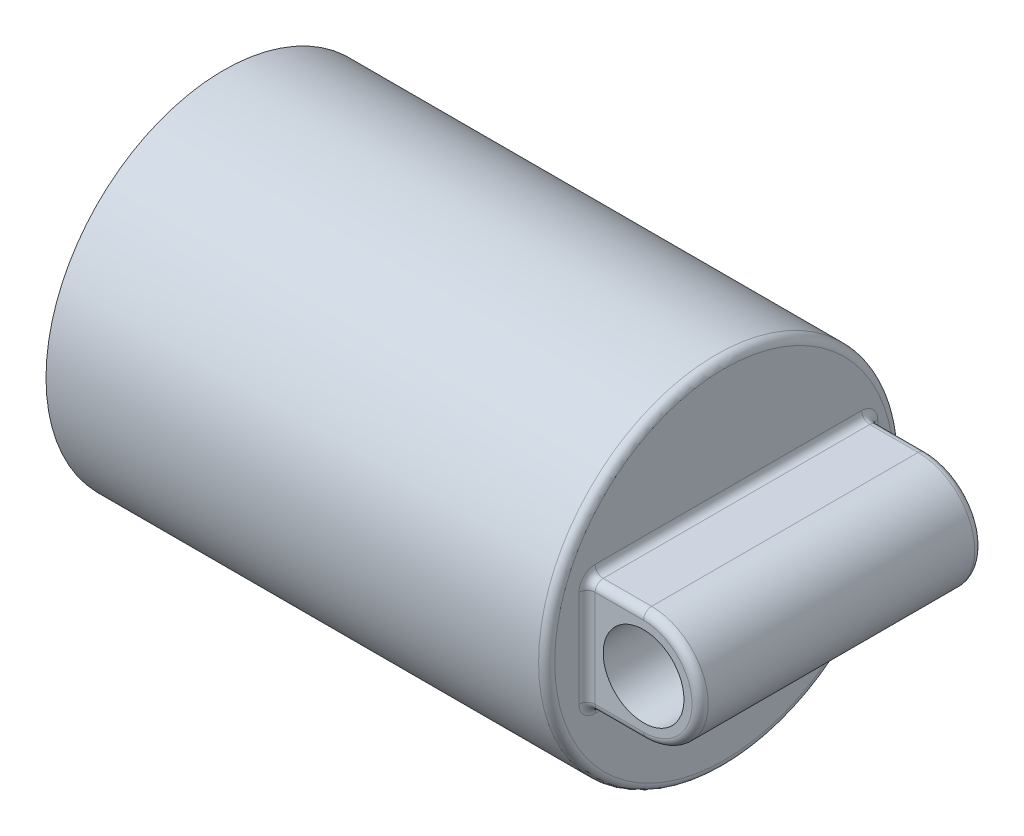
ISO-10303-21;
HEADER;
FILE_DESCRIPTION(('STEP AP214'),'2;1');
FILE_NAME('part.step','',(''),(''),'','','');
FILE_SCHEMA(('AUTOMOTIVE_DESIGN { 1 0 10303 214 1 1 1 1 }'));
ENDSEC;
DATA;
#1=APPLICATION_CONTEXT('core data for automotive mechanical design processes');
#2=APPLICATION_PROTOCOL_DEFINITION('international standard','automotive_design',2000,#1);
#3=PRODUCT_CONTEXT('',#1,'mechanical');
#4=PRODUCT('Part','Part','',(#3));
#5=PRODUCT_RELATED_PRODUCT_CATEGORY('part','',(#4));
#6=PRODUCT_DEFINITION_FORMATION('','',#4);
#7=PRODUCT_DEFINITION_CONTEXT('part definition',#1,'design');
#8=PRODUCT_DEFINITION('design','',#6,#7);
#9=PRODUCT_DEFINITION_SHAPE('','',#8);
#10=(LENGTH_UNIT() NAMED_UNIT(*) SI_UNIT(.MILLI.,.METRE.));
#11=(NAMED_UNIT(*) PLANE_ANGLE_UNIT() SI_UNIT($,.RADIAN.));
#12=(NAMED_UNIT(*) SI_UNIT($,.STERADIAN.) SOLID_ANGLE_UNIT());
#13=UNCERTAINTY_MEASURE_WITH_UNIT(LENGTH_MEASURE(1.E-05),#10,'distance_accuracy_value','');
#14=(GEOMETRIC_REPRESENTATION_CONTEXT(3) GLOBAL_UNCERTAINTY_ASSIGNED_CONTEXT((#13)) GLOBAL_UNIT_ASSIGNED_CONTEXT((#10,
#11,#12)) REPRESENTATION_CONTEXT('',''));
#15=CARTESIAN_POINT('',(0.,0.,0.));
#16=DIRECTION('',(0.,0.,1.));
#17=DIRECTION('',(1.,0.,0.));
#18=AXIS2_PLACEMENT_3D('',#15,#16,#17);
#19=CARTESIAN_POINT('',(2.,22.,0.));
#20=DIRECTION('',(-1.,0.,0.));
#21=DIRECTION('',(0.,0.,1.));
#22=AXIS2_PLACEMENT_3D('',#19,#20,#21);
#23=PLANE('',#22);
#24=CARTESIAN_POINT('',(2.,0.,0.));
#25=DIRECTION('',(-1.,0.,0.));
#26=DIRECTION('',(0.,0.,1.));
#27=AXIS2_PLACEMENT_3D('',#24,#25,#26);
#28=CIRCLE('',#27,21.);
#29=CARTESIAN_POINT('',(2.,0.,21.));
#30=VERTEX_POINT('',#29);
#31=EDGE_CURVE('E151',#30,#30,#28,.F.);
#32=ORIENTED_EDGE('',*,*,#31,.T.);
#33=EDGE_LOOP('',(#32));
#34=FACE_BOUND('',#33,.T.);
#35=CARTESIAN_POINT('',(2.,-6.,16.));
#36=DIRECTION('',(-1.,0.,0.));
#37=DIRECTION('',(0.,0.,1.));
#38=AXIS2_PLACEMENT_3D('',#35,#36,#37);
#39=CIRCLE('',#38,2.);
#40=CARTESIAN_POINT('',(2.,-6.,18.));
#41=VERTEX_POINT('',#40);
#42=CARTESIAN_POINT('',(2.,-8.,16.));
#43=VERTEX_POINT('',#42);
#44=EDGE_CURVE('E231',#41,#43,#39,.F.);
#45=ORIENTED_EDGE('',*,*,#44,.F.);
#46=DIRECTION('',(0.,-1.,0.));
#47=VECTOR('',#46,1.);
#48=CARTESIAN_POINT('',(2.,22.,18.));
#49=LINE('',#48,#47);
#50=CARTESIAN_POINT('',(2.,6.,18.));
#51=VERTEX_POINT('',#50);
#52=EDGE_CURVE('E228',#41,#51,#49,.F.);
#53=ORIENTED_EDGE('',*,*,#52,.T.);
#54=CARTESIAN_POINT('',(2.,6.,16.));
#55=DIRECTION('',(-1.,0.,0.));
#56=DIRECTION('',(0.,0.,1.));
#57=AXIS2_PLACEMENT_3D('',#54,#55,#56);
#58=CIRCLE('',#57,2.);
#59=CARTESIAN_POINT('',(2.,8.,16.));
#60=VERTEX_POINT('',#59);
#61=EDGE_CURVE('E225',#60,#51,#58,.F.);
#62=ORIENTED_EDGE('',*,*,#61,.F.);
#63=DIRECTION('',(0.,0.,1.));
#64=VECTOR('',#63,1.);
#65=CARTESIAN_POINT('',(2.,8.,0.));
#66=LINE('',#65,#64);
#67=CARTESIAN_POINT('',(2.,8.,-17.));
#68=VERTEX_POINT('',#67);
#69=EDGE_CURVE('E221',#60,#68,#66,.F.);
#70=ORIENTED_EDGE('',*,*,#69,.T.);
#71=CARTESIAN_POINT('',(2.,6.,-17.));
#72=DIRECTION('',(-1.,0.,0.));
#73=DIRECTION('',(0.,0.,1.));
#74=AXIS2_PLACEMENT_3D('',#71,#72,#73);
#75=CIRCLE('',#74,2.);
#76=CARTESIAN_POINT('',(2.,6.,-19.));
#77=VERTEX_POINT('',#76);
#78=EDGE_CURVE('E218',#77,#68,#75,.F.);
#79=ORIENTED_EDGE('',*,*,#78,.F.);
#80=DIRECTION('',(0.,-1.,0.));
#81=VECTOR('',#80,1.);
#82=CARTESIAN_POINT('',(2.,-7.,-19.));
#83=LINE('',#82,#81);
#84=CARTESIAN_POINT('',(2.,-6.,-19.));
#85=VERTEX_POINT('',#84);
#86=EDGE_CURVE('E216',#77,#85,#83,.T.);
#87=ORIENTED_EDGE('',*,*,#86,.T.);
#88=CARTESIAN_POINT('',(2.,-6.,-17.));
#89=DIRECTION('',(-1.,0.,0.));
#90=DIRECTION('',(0.,0.,1.));
#91=AXIS2_PLACEMENT_3D('',#88,#89,#90);
#92=CIRCLE('',#91,2.);
#93=CARTESIAN_POINT('',(2.,-8.,-17.));
#94=VERTEX_POINT('',#93);
#95=EDGE_CURVE('E214',#94,#85,#92,.F.);
#96=ORIENTED_EDGE('',*,*,#95,.F.);
#97=DIRECTION('',(0.,0.,1.));
#98=VECTOR('',#97,1.);
#99=CARTESIAN_POINT('',(2.,-8.,0.));
#100=LINE('',#99,#98);
#101=EDGE_CURVE('E223',#94,#43,#100,.T.);
#102=ORIENTED_EDGE('',*,*,#101,.T.);
#103=EDGE_LOOP('',(#45,#53,#62,#70,#79,#87,#96,#102));
#104=FACE_BOUND('',#103,.T.);
#105=ADVANCED_FACE('F36',(#34,#104),#23,.F.);
#106=CARTESIAN_POINT('',(0.,0.,0.));
#107=DIRECTION('',(1.,0.,0.));
#108=DIRECTION('',(0.,0.,-1.));
#109=AXIS2_PLACEMENT_3D('',#106,#107,#108);
#110=PLANE('',#109);
#111=CARTESIAN_POINT('',(0.,0.,0.));
#112=DIRECTION('',(-1.,0.,0.));
#113=DIRECTION('',(0.,0.,1.));
#114=AXIS2_PLACEMENT_3D('',#111,#112,#113);
#115=CIRCLE('',#114,20.);
#116=CARTESIAN_POINT('',(0.,0.,20.));
#117=VERTEX_POINT('',#116);
#118=EDGE_CURVE('E204',#117,#117,#115,.T.);
#119=ORIENTED_EDGE('',*,*,#118,.T.);
#120=EDGE_LOOP('',(#119));
#121=FACE_BOUND('',#120,.T.);
#122=ADVANCED_FACE('F306',(#121),#110,.F.);
#123=CARTESIAN_POINT('',(-25.911369331656,0.,0.));
#124=DIRECTION('',(-1.,0.,0.));
#125=DIRECTION('',(0.,0.,1.));
#126=AXIS2_PLACEMENT_3D('',#123,#124,#125);
#127=CYLINDRICAL_SURFACE('',#126,20.);
#128=ORIENTED_EDGE('',*,*,#118,.F.);
#129=EDGE_LOOP('',(#128));
#130=FACE_BOUND('',#129,.T.);
#131=CARTESIAN_POINT('',(-60.,0.,0.));
#132=DIRECTION('',(-1.,0.,0.));
#133=DIRECTION('',(0.,0.,1.));
#134=AXIS2_PLACEMENT_3D('',#131,#132,#133);
#135=CIRCLE('',#134,20.);
#136=CARTESIAN_POINT('',(-60.,0.,20.));
#137=VERTEX_POINT('',#136);
#138=EDGE_CURVE('E201',#137,#137,#135,.T.);
#139=ORIENTED_EDGE('',*,*,#138,.T.);
#140=EDGE_LOOP('',(#139));
#141=FACE_BOUND('',#140,.T.);
#142=ADVANCED_FACE('F312',(#130,#141),#127,.F.);
#143=CARTESIAN_POINT('',(-60.,20.,0.));
#144=DIRECTION('',(1.,0.,0.));
#145=DIRECTION('',(0.,0.,-1.));
#146=AXIS2_PLACEMENT_3D('',#143,#144,#145);
#147=PLANE('',#146);
#148=ORIENTED_EDGE('',*,*,#138,.F.);
#149=EDGE_LOOP('',(#148));
#150=FACE_BOUND('',#149,.T.);
#151=CARTESIAN_POINT('',(-60.,0.,0.));
#152=DIRECTION('',(-1.,0.,0.));
#153=DIRECTION('',(0.,0.,1.));
#154=AXIS2_PLACEMENT_3D('',#151,#152,#153);
#155=CIRCLE('',#154,22.);
#156=CARTESIAN_POINT('',(-60.,0.,22.));
#157=VERTEX_POINT('',#156);
#158=EDGE_CURVE('E196',#157,#157,#155,.T.);
#159=ORIENTED_EDGE('',*,*,#158,.T.);
#160=EDGE_LOOP('',(#159));
#161=FACE_BOUND('',#160,.T.);
#162=ADVANCED_FACE('F322',(#150,#161),#147,.F.);
#163=CARTESIAN_POINT('',(-25.911369331656,0.,0.));
#164=DIRECTION('',(-1.,0.,0.));
#165=DIRECTION('',(0.,0.,1.));
#166=AXIS2_PLACEMENT_3D('',#163,#164,#165);
#167=CYLINDRICAL_SURFACE('',#166,22.);
#168=CARTESIAN_POINT('',(1.,0.,0.));
#169=DIRECTION('',(-1.,0.,0.));
#170=DIRECTION('',(0.,0.,1.));
#171=AXIS2_PLACEMENT_3D('',#168,#169,#170);
#172=CIRCLE('',#171,22.);
#173=CARTESIAN_POINT('',(1.,0.,22.));
#174=VERTEX_POINT('',#173);
#175=EDGE_CURVE('E207',#174,#174,#172,.T.);
#176=ORIENTED_EDGE('',*,*,#175,.T.);
#177=EDGE_LOOP('',(#176));
#178=FACE_BOUND('',#177,.T.);
#179=ORIENTED_EDGE('',*,*,#158,.F.);
#180=EDGE_LOOP('',(#179));
#181=FACE_BOUND('',#180,.T.);
#182=ADVANCED_FACE('F319',(#178,#181),#167,.T.);
#183=CARTESIAN_POINT('',(9.,0.,-18.));
#184=DIRECTION('',(0.,0.,1.));
#185=DIRECTION('',(1.,0.,0.));
#186=AXIS2_PLACEMENT_3D('',#183,#184,#185);
#187=CYLINDRICAL_SURFACE('',#186,7.);
#188=DIRECTION('',(0.,0.,1.));
#189=VECTOR('',#188,1.);
#190=CARTESIAN_POINT('',(9.,-7.,-18.));
#191=LINE('',#190,#189);
#192=CARTESIAN_POINT('',(9.,-7.,-17.));
#193=VERTEX_POINT('',#192);
#194=CARTESIAN_POINT('',(9.,-7.,16.));
#195=VERTEX_POINT('',#194);
#196=EDGE_CURVE('E193',#193,#195,#191,.T.);
#197=ORIENTED_EDGE('',*,*,#196,.F.);
#198=CARTESIAN_POINT('',(9.,0.,-17.));
#199=DIRECTION('',(0.,0.,1.));
#200=DIRECTION('',(1.,0.,0.));
#201=AXIS2_PLACEMENT_3D('',#198,#199,#200);
#202=CIRCLE('',#201,7.);
#203=CARTESIAN_POINT('',(9.,7.,-17.));
#204=VERTEX_POINT('',#203);
#205=EDGE_CURVE('E11',#193,#204,#202,.T.);
#206=ORIENTED_EDGE('',*,*,#205,.T.);
#207=DIRECTION('',(0.,0.,1.));
#208=VECTOR('',#207,1.);
#209=CARTESIAN_POINT('',(9.,7.,-18.));
#210=LINE('',#209,#208);
#211=CARTESIAN_POINT('',(9.,7.,16.));
#212=VERTEX_POINT('',#211);
#213=EDGE_CURVE('E190',#204,#212,#210,.T.);
#214=ORIENTED_EDGE('',*,*,#213,.T.);
#215=CARTESIAN_POINT('',(9.,0.,16.));
#216=DIRECTION('',(0.,0.,1.));
#217=DIRECTION('',(1.,0.,0.));
#218=AXIS2_PLACEMENT_3D('',#215,#216,#217);
#219=CIRCLE('',#218,7.);
#220=EDGE_CURVE('E45',#212,#195,#219,.F.);
#221=ORIENTED_EDGE('',*,*,#220,.T.);
#222=EDGE_LOOP('',(#197,#206,#214,#221));
#223=FACE_BOUND('',#222,.T.);
#224=ADVANCED_FACE('F317',(#223),#187,.T.);
#225=CARTESIAN_POINT('',(2.,-7.,-18.));
#226=DIRECTION('',(0.,-1.,0.));
#227=DIRECTION('',(1.,0.,0.));
#228=AXIS2_PLACEMENT_3D('',#225,#226,#227);
#229=PLANE('',#228);
#230=DIRECTION('',(0.,0.,1.));
#231=VECTOR('',#230,1.);
#232=CARTESIAN_POINT('',(3.,-7.,-18.));
#233=LINE('',#232,#231);
#234=CARTESIAN_POINT('',(3.,-7.,16.));
#235=VERTEX_POINT('',#234);
#236=CARTESIAN_POINT('',(3.,-7.,-17.));
#237=VERTEX_POINT('',#236);
#238=EDGE_CURVE('E235',#235,#237,#233,.F.);
#239=ORIENTED_EDGE('',*,*,#238,.T.);
#240=DIRECTION('',(1.,0.,0.));
#241=VECTOR('',#240,1.);
#242=CARTESIAN_POINT('',(9.,-7.,-17.));
#243=LINE('',#242,#241);
#244=EDGE_CURVE('E238',#237,#193,#243,.T.);
#245=ORIENTED_EDGE('',*,*,#244,.T.);
#246=ORIENTED_EDGE('',*,*,#196,.T.);
#247=DIRECTION('',(1.,0.,0.));
#248=VECTOR('',#247,1.);
#249=CARTESIAN_POINT('',(2.,-7.,16.));
#250=LINE('',#249,#248);
#251=EDGE_CURVE('E154',#195,#235,#250,.F.);
#252=ORIENTED_EDGE('',*,*,#251,.T.);
#253=EDGE_LOOP('',(#239,#245,#246,#252));
#254=FACE_BOUND('',#253,.T.);
#255=ADVANCED_FACE('F357',(#254),#229,.T.);
#256=CARTESIAN_POINT('',(9.,7.,-18.));
#257=DIRECTION('',(0.,1.,0.));
#258=DIRECTION('',(-1.,0.,0.));
#259=AXIS2_PLACEMENT_3D('',#256,#257,#258);
#260=PLANE('',#259);
#261=ORIENTED_EDGE('',*,*,#213,.F.);
#262=DIRECTION('',(-1.,0.,0.));
#263=VECTOR('',#262,1.);
#264=CARTESIAN_POINT('',(2.,7.,-17.));
#265=LINE('',#264,#263);
#266=CARTESIAN_POINT('',(3.,7.,-17.));
#267=VERTEX_POINT('',#266);
#268=EDGE_CURVE('E244',#204,#267,#265,.T.);
#269=ORIENTED_EDGE('',*,*,#268,.T.);
#270=DIRECTION('',(0.,0.,1.));
#271=VECTOR('',#270,1.);
#272=CARTESIAN_POINT('',(3.,7.,-18.));
#273=LINE('',#272,#271);
#274=CARTESIAN_POINT('',(3.,7.,16.));
#275=VERTEX_POINT('',#274);
#276=EDGE_CURVE('E242',#267,#275,#273,.T.);
#277=ORIENTED_EDGE('',*,*,#276,.T.);
#278=DIRECTION('',(-1.,0.,0.));
#279=VECTOR('',#278,1.);
#280=CARTESIAN_POINT('',(9.,7.,16.));
#281=LINE('',#280,#279);
#282=EDGE_CURVE('E240',#275,#212,#281,.F.);
#283=ORIENTED_EDGE('',*,*,#282,.T.);
#284=EDGE_LOOP('',(#261,#269,#277,#283));
#285=FACE_BOUND('',#284,.T.);
#286=ADVANCED_FACE('F355',(#285),#260,.T.);
#287=CARTESIAN_POINT('',(9.,0.,-18.));
#288=DIRECTION('',(0.,0.,1.));
#289=DIRECTION('',(1.,0.,0.));
#290=AXIS2_PLACEMENT_3D('',#287,#288,#289);
#291=PLANE('',#290);
#292=DIRECTION('',(1.,0.,0.));
#293=VECTOR('',#292,1.);
#294=CARTESIAN_POINT('',(2.,-6.,-18.));
#295=LINE('',#294,#293);
#296=CARTESIAN_POINT('',(9.,-6.,-18.));
#297=VERTEX_POINT('',#296);
#298=CARTESIAN_POINT('',(3.,-6.,-18.));
#299=VERTEX_POINT('',#298);
#300=EDGE_CURVE('E250',#297,#299,#295,.F.);
#301=ORIENTED_EDGE('',*,*,#300,.T.);
#302=DIRECTION('',(0.,-1.,0.));
#303=VECTOR('',#302,1.);
#304=CARTESIAN_POINT('',(3.,7.,-18.));
#305=LINE('',#304,#303);
#306=CARTESIAN_POINT('',(3.,6.,-18.));
#307=VERTEX_POINT('',#306);
#308=EDGE_CURVE('E61',#299,#307,#305,.F.);
#309=ORIENTED_EDGE('',*,*,#308,.T.);
#310=DIRECTION('',(-1.,0.,0.));
#311=VECTOR('',#310,1.);
#312=CARTESIAN_POINT('',(9.,6.,-18.));
#313=LINE('',#312,#311);
#314=CARTESIAN_POINT('',(9.,6.,-18.));
#315=VERTEX_POINT('',#314);
#316=EDGE_CURVE('E248',#307,#315,#313,.F.);
#317=ORIENTED_EDGE('',*,*,#316,.T.);
#318=CARTESIAN_POINT('',(9.,0.,-18.));
#319=DIRECTION('',(0.,0.,1.));
#320=DIRECTION('',(1.,0.,0.));
#321=AXIS2_PLACEMENT_3D('',#318,#319,#320);
#322=CIRCLE('',#321,6.);
#323=EDGE_CURVE('E246',#315,#297,#322,.F.);
#324=ORIENTED_EDGE('',*,*,#323,.T.);
#325=EDGE_LOOP('',(#301,#309,#317,#324));
#326=FACE_BOUND('',#325,.T.);
#327=CARTESIAN_POINT('',(9.,0.,-18.));
#328=DIRECTION('',(0.,0.,1.));
#329=DIRECTION('',(1.,0.,0.));
#330=AXIS2_PLACEMENT_3D('',#327,#328,#329);
#331=CIRCLE('',#330,5.);
#332=CARTESIAN_POINT('',(14.,0.,-18.));
#333=VERTEX_POINT('',#332);
#334=EDGE_CURVE('E185',#333,#333,#331,.T.);
#335=ORIENTED_EDGE('',*,*,#334,.T.);
#336=EDGE_LOOP('',(#335));
#337=FACE_BOUND('',#336,.T.);
#338=ADVANCED_FACE('F350',(#326,#337),#291,.F.);
#339=CARTESIAN_POINT('',(9.,0.,17.));
#340=DIRECTION('',(0.,0.,1.));
#341=DIRECTION('',(1.,0.,0.));
#342=AXIS2_PLACEMENT_3D('',#339,#340,#341);
#343=PLANE('',#342);
#344=DIRECTION('',(-1.,0.,0.));
#345=VECTOR('',#344,1.);
#346=CARTESIAN_POINT('',(9.,6.,17.));
#347=LINE('',#346,#345);
#348=CARTESIAN_POINT('',(9.,6.,17.));
#349=VERTEX_POINT('',#348);
#350=CARTESIAN_POINT('',(3.,6.,17.));
#351=VERTEX_POINT('',#350);
#352=EDGE_CURVE('E140',#349,#351,#347,.T.);
#353=ORIENTED_EDGE('',*,*,#352,.T.);
#354=DIRECTION('',(0.,-1.,0.));
#355=VECTOR('',#354,1.);
#356=CARTESIAN_POINT('',(3.,0.,17.));
#357=LINE('',#356,#355);
#358=CARTESIAN_POINT('',(3.,-6.,17.));
#359=VERTEX_POINT('',#358);
#360=EDGE_CURVE('E136',#351,#359,#357,.T.);
#361=ORIENTED_EDGE('',*,*,#360,.T.);
#362=DIRECTION('',(1.,0.,0.));
#363=VECTOR('',#362,1.);
#364=CARTESIAN_POINT('',(9.,-6.,17.));
#365=LINE('',#364,#363);
#366=CARTESIAN_POINT('',(9.,-6.,17.));
#367=VERTEX_POINT('',#366);
#368=EDGE_CURVE('E129',#359,#367,#365,.T.);
#369=ORIENTED_EDGE('',*,*,#368,.T.);
#370=CARTESIAN_POINT('',(9.,0.,17.));
#371=DIRECTION('',(0.,0.,1.));
#372=DIRECTION('',(1.,0.,0.));
#373=AXIS2_PLACEMENT_3D('',#370,#371,#372);
#374=CIRCLE('',#373,6.);
#375=EDGE_CURVE('E133',#367,#349,#374,.T.);
#376=ORIENTED_EDGE('',*,*,#375,.T.);
#377=EDGE_LOOP('',(#353,#361,#369,#376));
#378=FACE_BOUND('',#377,.T.);
#379=CARTESIAN_POINT('',(9.,0.,17.));
#380=DIRECTION('',(0.,0.,1.));
#381=DIRECTION('',(1.,0.,0.));
#382=AXIS2_PLACEMENT_3D('',#379,#380,#381);
#383=CIRCLE('',#382,5.);
#384=CARTESIAN_POINT('',(14.,0.,17.));
#385=VERTEX_POINT('',#384);
#386=EDGE_CURVE('E180',#385,#385,#383,.T.);
#387=ORIENTED_EDGE('',*,*,#386,.F.);
#388=EDGE_LOOP('',(#387));
#389=FACE_BOUND('',#388,.T.);
#390=ADVANCED_FACE('F131',(#378,#389),#343,.T.);
#391=CARTESIAN_POINT('',(9.,0.,-18.));
#392=DIRECTION('',(0.,0.,1.));
#393=DIRECTION('',(1.,0.,0.));
#394=AXIS2_PLACEMENT_3D('',#391,#392,#393);
#395=CYLINDRICAL_SURFACE('',#394,5.);
#396=ORIENTED_EDGE('',*,*,#334,.F.);
#397=EDGE_LOOP('',(#396));
#398=FACE_BOUND('',#397,.T.);
#399=ORIENTED_EDGE('',*,*,#386,.T.);
#400=EDGE_LOOP('',(#399));
#401=FACE_BOUND('',#400,.T.);
#402=ADVANCED_FACE('F331',(#398,#401),#395,.F.);
#403=CARTESIAN_POINT('',(1.,0.,0.));
#404=DIRECTION('',(-1.,0.,0.));
#405=DIRECTION('',(0.,0.,1.));
#406=AXIS2_PLACEMENT_3D('',#403,#404,#405);
#407=TOROIDAL_SURFACE('',#406,21.,1.);
#408=ORIENTED_EDGE('',*,*,#31,.F.);
#409=EDGE_LOOP('',(#408));
#410=FACE_BOUND('',#409,.T.);
#411=ORIENTED_EDGE('',*,*,#175,.F.);
#412=EDGE_LOOP('',(#411));
#413=FACE_BOUND('',#412,.T.);
#414=ADVANCED_FACE('F329',(#410,#413),#407,.T.);
#415=CARTESIAN_POINT('',(9.,0.,-17.));
#416=DIRECTION('',(0.,0.,1.));
#417=DIRECTION('',(1.,0.,0.));
#418=AXIS2_PLACEMENT_3D('',#415,#416,#417);
#419=TOROIDAL_SURFACE('',#418,6.,1.);
#420=CARTESIAN_POINT('',(9.,-6.,-17.));
#421=DIRECTION('',(-1.,0.,0.));
#422=DIRECTION('',(0.,0.,1.));
#423=AXIS2_PLACEMENT_3D('',#420,#421,#422);
#424=CIRCLE('',#423,1.);
#425=EDGE_CURVE('E173',#297,#193,#424,.T.);
#426=ORIENTED_EDGE('',*,*,#425,.F.);
#427=ORIENTED_EDGE('',*,*,#323,.F.);
#428=CARTESIAN_POINT('',(9.,6.,-17.));
#429=DIRECTION('',(-1.,0.,0.));
#430=DIRECTION('',(0.,0.,1.));
#431=AXIS2_PLACEMENT_3D('',#428,#429,#430);
#432=CIRCLE('',#431,1.);
#433=EDGE_CURVE('E40',#204,#315,#432,.T.);
#434=ORIENTED_EDGE('',*,*,#433,.F.);
#435=ORIENTED_EDGE('',*,*,#205,.F.);
#436=EDGE_LOOP('',(#426,#427,#434,#435));
#437=FACE_BOUND('',#436,.T.);
#438=ADVANCED_FACE('F38',(#437),#419,.T.);
#439=CARTESIAN_POINT('',(9.,6.,-17.));
#440=DIRECTION('',(1.,0.,0.));
#441=DIRECTION('',(0.,1.,0.));
#442=AXIS2_PLACEMENT_3D('',#439,#440,#441);
#443=CYLINDRICAL_SURFACE('',#442,1.);
#444=ORIENTED_EDGE('',*,*,#433,.T.);
#445=ORIENTED_EDGE('',*,*,#316,.F.);
#446=CARTESIAN_POINT('',(3.,6.,-17.));
#447=DIRECTION('',(-1.,0.,0.));
#448=DIRECTION('',(0.,0.,1.));
#449=AXIS2_PLACEMENT_3D('',#446,#447,#448);
#450=CIRCLE('',#449,1.);
#451=EDGE_CURVE('E168',#267,#307,#450,.T.);
#452=ORIENTED_EDGE('',*,*,#451,.F.);
#453=ORIENTED_EDGE('',*,*,#268,.F.);
#454=EDGE_LOOP('',(#444,#445,#452,#453));
#455=FACE_BOUND('',#454,.T.);
#456=ADVANCED_FACE('F337',(#455),#443,.T.);
#457=CARTESIAN_POINT('',(2.,-6.,-17.));
#458=DIRECTION('',(-1.,0.,0.));
#459=DIRECTION('',(0.,-1.,0.));
#460=AXIS2_PLACEMENT_3D('',#457,#458,#459);
#461=CYLINDRICAL_SURFACE('',#460,1.);
#462=ORIENTED_EDGE('',*,*,#425,.T.);
#463=ORIENTED_EDGE('',*,*,#244,.F.);
#464=CARTESIAN_POINT('',(3.,-6.,-17.));
#465=DIRECTION('',(-1.,0.,0.));
#466=DIRECTION('',(0.,0.,1.));
#467=AXIS2_PLACEMENT_3D('',#464,#465,#466);
#468=CIRCLE('',#467,1.);
#469=EDGE_CURVE('E166',#299,#237,#468,.T.);
#470=ORIENTED_EDGE('',*,*,#469,.F.);
#471=ORIENTED_EDGE('',*,*,#300,.F.);
#472=EDGE_LOOP('',(#462,#463,#470,#471));
#473=FACE_BOUND('',#472,.T.);
#474=ADVANCED_FACE('F370',(#473),#461,.T.);
#475=CARTESIAN_POINT('',(3.,22.,-19.));
#476=DIRECTION('',(0.,1.,0.));
#477=DIRECTION('',(0.,0.,1.));
#478=AXIS2_PLACEMENT_3D('',#475,#476,#477);
#479=CYLINDRICAL_SURFACE('',#478,1.);
#480=CARTESIAN_POINT('',(3.,-6.,-19.));
#481=DIRECTION('',(0.,1.,0.));
#482=DIRECTION('',(0.,0.,1.));
#483=AXIS2_PLACEMENT_3D('',#480,#481,#482);
#484=CIRCLE('',#483,1.);
#485=EDGE_CURVE('E53',#85,#299,#484,.T.);
#486=ORIENTED_EDGE('',*,*,#485,.F.);
#487=ORIENTED_EDGE('',*,*,#86,.F.);
#488=CARTESIAN_POINT('',(3.,6.,-19.));
#489=DIRECTION('',(0.,-1.,0.));
#490=DIRECTION('',(0.,0.,-1.));
#491=AXIS2_PLACEMENT_3D('',#488,#489,#490);
#492=CIRCLE('',#491,1.);
#493=EDGE_CURVE('E171',#307,#77,#492,.T.);
#494=ORIENTED_EDGE('',*,*,#493,.F.);
#495=ORIENTED_EDGE('',*,*,#308,.F.);
#496=EDGE_LOOP('',(#486,#487,#494,#495));
#497=FACE_BOUND('',#496,.T.);
#498=ADVANCED_FACE('F284',(#497),#479,.F.);
#499=CARTESIAN_POINT('',(3.,6.,-17.));
#500=DIRECTION('',(-1.,0.,0.));
#501=DIRECTION('',(0.,0.,1.));
#502=AXIS2_PLACEMENT_3D('',#499,#500,#501);
#503=TOROIDAL_SURFACE('',#502,2.,1.);
#504=ORIENTED_EDGE('',*,*,#493,.T.);
#505=ORIENTED_EDGE('',*,*,#78,.T.);
#506=CARTESIAN_POINT('',(3.,8.,-17.));
#507=DIRECTION('',(0.,0.,1.));
#508=DIRECTION('',(1.,0.,0.));
#509=AXIS2_PLACEMENT_3D('',#506,#507,#508);
#510=CIRCLE('',#509,1.);
#511=EDGE_CURVE('E157',#267,#68,#510,.F.);
#512=ORIENTED_EDGE('',*,*,#511,.F.);
#513=ORIENTED_EDGE('',*,*,#451,.T.);
#514=EDGE_LOOP('',(#504,#505,#512,#513));
#515=FACE_BOUND('',#514,.T.);
#516=ADVANCED_FACE('F280',(#515),#503,.F.);
#517=CARTESIAN_POINT('',(9.,0.,16.));
#518=DIRECTION('',(0.,0.,1.));
#519=DIRECTION('',(1.,0.,0.));
#520=AXIS2_PLACEMENT_3D('',#517,#518,#519);
#521=TOROIDAL_SURFACE('',#520,6.,1.);
#522=CARTESIAN_POINT('',(9.,-6.,16.));
#523=DIRECTION('',(-1.,0.,0.));
#524=DIRECTION('',(0.,0.,1.));
#525=AXIS2_PLACEMENT_3D('',#522,#523,#524);
#526=CIRCLE('',#525,1.);
#527=EDGE_CURVE('E146',#195,#367,#526,.T.);
#528=ORIENTED_EDGE('',*,*,#527,.F.);
#529=ORIENTED_EDGE('',*,*,#220,.F.);
#530=CARTESIAN_POINT('',(9.,6.,16.));
#531=DIRECTION('',(-1.,0.,0.));
#532=DIRECTION('',(0.,0.,1.));
#533=AXIS2_PLACEMENT_3D('',#530,#531,#532);
#534=CIRCLE('',#533,1.);
#535=EDGE_CURVE('E149',#349,#212,#534,.T.);
#536=ORIENTED_EDGE('',*,*,#535,.F.);
#537=ORIENTED_EDGE('',*,*,#375,.F.);
#538=EDGE_LOOP('',(#528,#529,#536,#537));
#539=FACE_BOUND('',#538,.T.);
#540=ADVANCED_FACE('F144',(#539),#521,.T.);
#541=CARTESIAN_POINT('',(3.,-6.,-17.));
#542=DIRECTION('',(-1.,0.,0.));
#543=DIRECTION('',(0.,0.,1.));
#544=AXIS2_PLACEMENT_3D('',#541,#542,#543);
#545=TOROIDAL_SURFACE('',#544,2.,1.);
#546=ORIENTED_EDGE('',*,*,#485,.T.);
#547=ORIENTED_EDGE('',*,*,#469,.T.);
#548=CARTESIAN_POINT('',(3.,-8.,-17.));
#549=DIRECTION('',(0.,0.,1.));
#550=DIRECTION('',(1.,0.,0.));
#551=AXIS2_PLACEMENT_3D('',#548,#549,#550);
#552=CIRCLE('',#551,1.);
#553=EDGE_CURVE('E155',#94,#237,#552,.F.);
#554=ORIENTED_EDGE('',*,*,#553,.F.);
#555=ORIENTED_EDGE('',*,*,#95,.T.);
#556=EDGE_LOOP('',(#546,#547,#554,#555));
#557=FACE_BOUND('',#556,.T.);
#558=ADVANCED_FACE('F288',(#557),#545,.F.);
#559=CARTESIAN_POINT('',(3.,8.,-18.));
#560=DIRECTION('',(0.,0.,1.));
#561=DIRECTION('',(1.,0.,0.));
#562=AXIS2_PLACEMENT_3D('',#559,#560,#561);
#563=CYLINDRICAL_SURFACE('',#562,1.);
#564=ORIENTED_EDGE('',*,*,#511,.T.);
#565=ORIENTED_EDGE('',*,*,#69,.F.);
#566=CARTESIAN_POINT('',(3.,8.,16.));
#567=DIRECTION('',(0.,0.,-1.));
#568=DIRECTION('',(-1.,0.,0.));
#569=AXIS2_PLACEMENT_3D('',#566,#567,#568);
#570=CIRCLE('',#569,1.);
#571=EDGE_CURVE('E159',#275,#60,#570,.T.);
#572=ORIENTED_EDGE('',*,*,#571,.F.);
#573=ORIENTED_EDGE('',*,*,#276,.F.);
#574=EDGE_LOOP('',(#564,#565,#572,#573));
#575=FACE_BOUND('',#574,.T.);
#576=ADVANCED_FACE('F275',(#575),#563,.F.);
#577=CARTESIAN_POINT('',(9.,6.,16.));
#578=DIRECTION('',(-1.,0.,0.));
#579=DIRECTION('',(0.,-1.,0.));
#580=AXIS2_PLACEMENT_3D('',#577,#578,#579);
#581=CYLINDRICAL_SURFACE('',#580,1.);
#582=ORIENTED_EDGE('',*,*,#535,.T.);
#583=ORIENTED_EDGE('',*,*,#282,.F.);
#584=CARTESIAN_POINT('',(3.,6.,16.));
#585=DIRECTION('',(-1.,0.,0.));
#586=DIRECTION('',(0.,0.,1.));
#587=AXIS2_PLACEMENT_3D('',#584,#585,#586);
#588=CIRCLE('',#587,1.);
#589=EDGE_CURVE('E264',#351,#275,#588,.T.);
#590=ORIENTED_EDGE('',*,*,#589,.F.);
#591=ORIENTED_EDGE('',*,*,#352,.F.);
#592=EDGE_LOOP('',(#582,#583,#590,#591));
#593=FACE_BOUND('',#592,.T.);
#594=ADVANCED_FACE('F373',(#593),#581,.T.);
#595=CARTESIAN_POINT('',(9.,-6.,16.));
#596=DIRECTION('',(1.,0.,0.));
#597=DIRECTION('',(0.,1.,0.));
#598=AXIS2_PLACEMENT_3D('',#595,#596,#597);
#599=CYLINDRICAL_SURFACE('',#598,1.);
#600=ORIENTED_EDGE('',*,*,#527,.T.);
#601=ORIENTED_EDGE('',*,*,#368,.F.);
#602=CARTESIAN_POINT('',(3.,-6.,16.));
#603=DIRECTION('',(-1.,0.,0.));
#604=DIRECTION('',(0.,0.,1.));
#605=AXIS2_PLACEMENT_3D('',#602,#603,#604);
#606=CIRCLE('',#605,1.);
#607=EDGE_CURVE('E261',#235,#359,#606,.T.);
#608=ORIENTED_EDGE('',*,*,#607,.F.);
#609=ORIENTED_EDGE('',*,*,#251,.F.);
#610=EDGE_LOOP('',(#600,#601,#608,#609));
#611=FACE_BOUND('',#610,.T.);
#612=ADVANCED_FACE('F153',(#611),#599,.T.);
#613=CARTESIAN_POINT('',(3.,-8.,0.));
#614=DIRECTION('',(0.,0.,1.));
#615=DIRECTION('',(1.,0.,0.));
#616=AXIS2_PLACEMENT_3D('',#613,#614,#615);
#617=CYLINDRICAL_SURFACE('',#616,1.);
#618=ORIENTED_EDGE('',*,*,#553,.T.);
#619=ORIENTED_EDGE('',*,*,#238,.F.);
#620=CARTESIAN_POINT('',(3.,-8.,16.));
#621=DIRECTION('',(0.,0.,-1.));
#622=DIRECTION('',(-1.,0.,0.));
#623=AXIS2_PLACEMENT_3D('',#620,#621,#622);
#624=CIRCLE('',#623,1.);
#625=EDGE_CURVE('E258',#43,#235,#624,.T.);
#626=ORIENTED_EDGE('',*,*,#625,.F.);
#627=ORIENTED_EDGE('',*,*,#101,.F.);
#628=EDGE_LOOP('',(#618,#619,#626,#627));
#629=FACE_BOUND('',#628,.T.);
#630=ADVANCED_FACE('F291',(#629),#617,.F.);
#631=CARTESIAN_POINT('',(3.,6.,16.));
#632=DIRECTION('',(-1.,0.,0.));
#633=DIRECTION('',(0.,0.,1.));
#634=AXIS2_PLACEMENT_3D('',#631,#632,#633);
#635=TOROIDAL_SURFACE('',#634,2.,1.);
#636=ORIENTED_EDGE('',*,*,#571,.T.);
#637=ORIENTED_EDGE('',*,*,#61,.T.);
#638=CARTESIAN_POINT('',(3.,6.,18.));
#639=DIRECTION('',(0.,-1.,0.));
#640=DIRECTION('',(0.,0.,-1.));
#641=AXIS2_PLACEMENT_3D('',#638,#639,#640);
#642=CIRCLE('',#641,1.);
#643=EDGE_CURVE('E256',#351,#51,#642,.F.);
#644=ORIENTED_EDGE('',*,*,#643,.F.);
#645=ORIENTED_EDGE('',*,*,#589,.T.);
#646=EDGE_LOOP('',(#636,#637,#644,#645));
#647=FACE_BOUND('',#646,.T.);
#648=ADVANCED_FACE('F269',(#647),#635,.F.);
#649=CARTESIAN_POINT('',(3.,-6.,16.));
#650=DIRECTION('',(-1.,0.,0.));
#651=DIRECTION('',(0.,0.,1.));
#652=AXIS2_PLACEMENT_3D('',#649,#650,#651);
#653=TOROIDAL_SURFACE('',#652,2.,1.);
#654=ORIENTED_EDGE('',*,*,#625,.T.);
#655=ORIENTED_EDGE('',*,*,#607,.T.);
#656=CARTESIAN_POINT('',(3.,-6.,18.));
#657=DIRECTION('',(0.,1.,0.));
#658=DIRECTION('',(0.,0.,1.));
#659=AXIS2_PLACEMENT_3D('',#656,#657,#658);
#660=CIRCLE('',#659,1.);
#661=EDGE_CURVE('E254',#41,#359,#660,.F.);
#662=ORIENTED_EDGE('',*,*,#661,.F.);
#663=ORIENTED_EDGE('',*,*,#44,.T.);
#664=EDGE_LOOP('',(#654,#655,#662,#663));
#665=FACE_BOUND('',#664,.T.);
#666=ADVANCED_FACE('F294',(#665),#653,.F.);
#667=CARTESIAN_POINT('',(3.,0.,18.));
#668=DIRECTION('',(0.,-1.,0.));
#669=DIRECTION('',(0.,0.,-1.));
#670=AXIS2_PLACEMENT_3D('',#667,#668,#669);
#671=CYLINDRICAL_SURFACE('',#670,1.);
#672=ORIENTED_EDGE('',*,*,#643,.T.);
#673=ORIENTED_EDGE('',*,*,#52,.F.);
#674=ORIENTED_EDGE('',*,*,#661,.T.);
#675=ORIENTED_EDGE('',*,*,#360,.F.);
#676=EDGE_LOOP('',(#672,#673,#674,#675));
#677=FACE_BOUND('',#676,.T.);
#678=ADVANCED_FACE('F297',(#677),#671,.F.);
#679=CLOSED_SHELL('',(#105,#122,#142,#162,#182,#224,#255,#286,#338,#390,#402,#414,#438,#456,
#474,#498,#516,#540,#558,#576,#594,#612,#630,#648,#666,#678));
#680=MANIFOLD_SOLID_BREP('B2',#679);
#681=ADVANCED_BREP_SHAPE_REPRESENTATION('',(#18,#680),#14);
#682=SHAPE_DEFINITION_REPRESENTATION(#9,#681);
ENDSEC;
END-ISO-10303-21;
